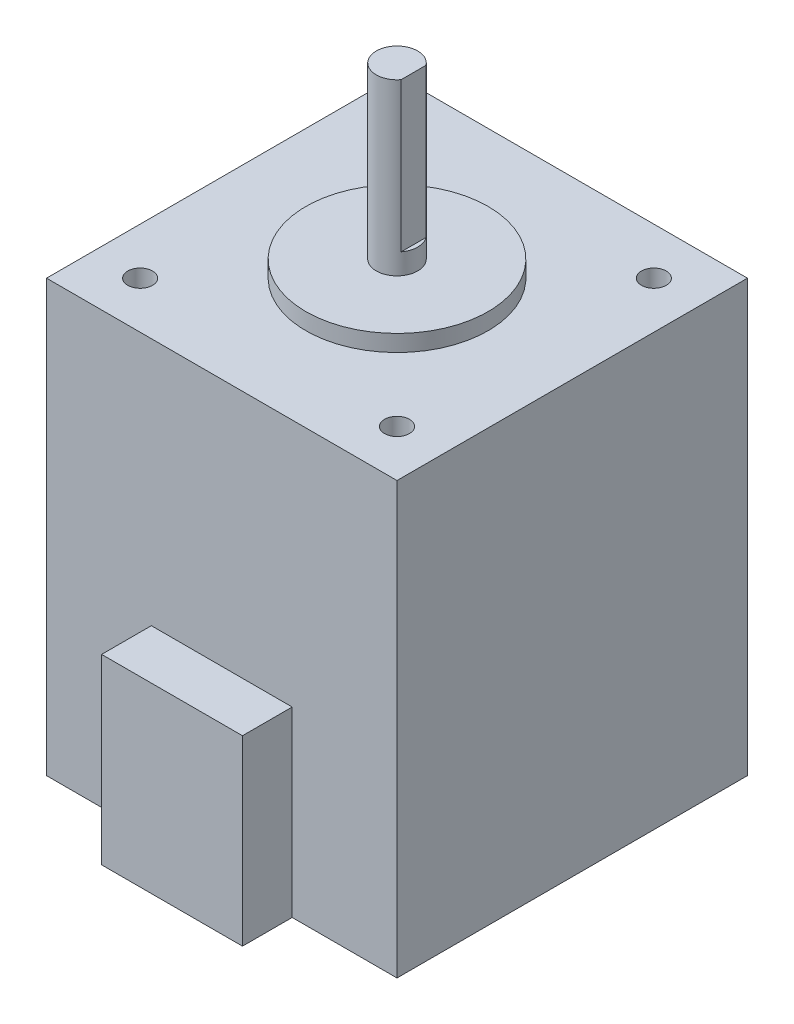
ISO-10303-21;
HEADER;
FILE_DESCRIPTION(('STEP AP214'),'2;1');
FILE_NAME('part.step','',(''),(''),'','','');
FILE_SCHEMA(('AUTOMOTIVE_DESIGN { 1 0 10303 214 1 1 1 1 }'));
ENDSEC;
DATA;
#1=APPLICATION_CONTEXT('core data for automotive mechanical design processes');
#2=APPLICATION_PROTOCOL_DEFINITION('international standard','automotive_design',2000,#1);
#3=PRODUCT_CONTEXT('',#1,'mechanical');
#4=PRODUCT('Part','Part','',(#3));
#5=PRODUCT_RELATED_PRODUCT_CATEGORY('part','',(#4));
#6=PRODUCT_DEFINITION_FORMATION('','',#4);
#7=PRODUCT_DEFINITION_CONTEXT('part definition',#1,'design');
#8=PRODUCT_DEFINITION('design','',#6,#7);
#9=PRODUCT_DEFINITION_SHAPE('','',#8);
#10=(LENGTH_UNIT() NAMED_UNIT(*) SI_UNIT(.MILLI.,.METRE.));
#11=(NAMED_UNIT(*) PLANE_ANGLE_UNIT() SI_UNIT($,.RADIAN.));
#12=(NAMED_UNIT(*) SI_UNIT($,.STERADIAN.) SOLID_ANGLE_UNIT());
#13=UNCERTAINTY_MEASURE_WITH_UNIT(LENGTH_MEASURE(1.E-05),#10,'distance_accuracy_value','');
#14=(GEOMETRIC_REPRESENTATION_CONTEXT(3) GLOBAL_UNCERTAINTY_ASSIGNED_CONTEXT((#13)) GLOBAL_UNIT_ASSIGNED_CONTEXT((#10,
#11,#12)) REPRESENTATION_CONTEXT('',''));
#15=CARTESIAN_POINT('',(0.,0.,0.));
#16=DIRECTION('',(0.,0.,1.));
#17=DIRECTION('',(1.,0.,0.));
#18=AXIS2_PLACEMENT_3D('',#15,#16,#17);
#19=CARTESIAN_POINT('',(-21.15,52.,21.15));
#20=DIRECTION('',(0.,0.,-1.));
#21=DIRECTION('',(-1.,0.,0.));
#22=AXIS2_PLACEMENT_3D('',#19,#20,#21);
#23=PLANE('',#22);
#24=DIRECTION('',(0.,-1.,0.));
#25=VECTOR('',#24,1.);
#26=CARTESIAN_POINT('',(-8.5,0.,21.15));
#27=LINE('',#26,#25);
#28=CARTESIAN_POINT('',(-8.5,22.,21.15));
#29=VERTEX_POINT('',#28);
#30=CARTESIAN_POINT('',(-8.5,0.,21.15));
#31=VERTEX_POINT('',#30);
#32=EDGE_CURVE('E62',#29,#31,#27,.T.);
#33=ORIENTED_EDGE('',*,*,#32,.F.);
#34=DIRECTION('',(-1.,0.,0.));
#35=VECTOR('',#34,1.);
#36=CARTESIAN_POINT('',(-8.5,22.,21.15));
#37=LINE('',#36,#35);
#38=CARTESIAN_POINT('',(8.5,22.,21.15));
#39=VERTEX_POINT('',#38);
#40=EDGE_CURVE('E146',#39,#29,#37,.T.);
#41=ORIENTED_EDGE('',*,*,#40,.F.);
#42=DIRECTION('',(0.,1.,0.));
#43=VECTOR('',#42,1.);
#44=CARTESIAN_POINT('',(8.5,0.,21.15));
#45=LINE('',#44,#43);
#46=CARTESIAN_POINT('',(8.5,0.,21.15));
#47=VERTEX_POINT('',#46);
#48=EDGE_CURVE('E68',#47,#39,#45,.T.);
#49=ORIENTED_EDGE('',*,*,#48,.F.);
#50=DIRECTION('',(1.,0.,0.));
#51=VECTOR('',#50,1.);
#52=CARTESIAN_POINT('',(-21.15,0.,21.15));
#53=LINE('',#52,#51);
#54=CARTESIAN_POINT('',(21.15,0.,21.15));
#55=VERTEX_POINT('',#54);
#56=EDGE_CURVE('E238',#47,#55,#53,.T.);
#57=ORIENTED_EDGE('',*,*,#56,.T.);
#58=DIRECTION('',(0.,-1.,0.));
#59=VECTOR('',#58,1.);
#60=CARTESIAN_POINT('',(21.15,52.,21.15));
#61=LINE('',#60,#59);
#62=CARTESIAN_POINT('',(21.15,52.,21.15));
#63=VERTEX_POINT('',#62);
#64=EDGE_CURVE('E228',#63,#55,#61,.T.);
#65=ORIENTED_EDGE('',*,*,#64,.F.);
#66=DIRECTION('',(1.,0.,0.));
#67=VECTOR('',#66,1.);
#68=CARTESIAN_POINT('',(-21.15,52.,21.15));
#69=LINE('',#68,#67);
#70=CARTESIAN_POINT('',(-21.15,52.,21.15));
#71=VERTEX_POINT('',#70);
#72=EDGE_CURVE('E225',#71,#63,#69,.T.);
#73=ORIENTED_EDGE('',*,*,#72,.F.);
#74=DIRECTION('',(0.,-1.,0.));
#75=VECTOR('',#74,1.);
#76=CARTESIAN_POINT('',(-21.15,52.,21.15));
#77=LINE('',#76,#75);
#78=CARTESIAN_POINT('',(-21.15,0.,21.15));
#79=VERTEX_POINT('',#78);
#80=EDGE_CURVE('E244',#71,#79,#77,.T.);
#81=ORIENTED_EDGE('',*,*,#80,.T.);
#82=EDGE_CURVE('E219',#79,#31,#53,.T.);
#83=ORIENTED_EDGE('',*,*,#82,.T.);
#84=EDGE_LOOP('',(#33,#41,#49,#57,#65,#73,#81,#83));
#85=FACE_BOUND('',#84,.T.);
#86=ADVANCED_FACE('F45',(#85),#23,.F.);
#87=CARTESIAN_POINT('',(21.15,52.,21.15));
#88=DIRECTION('',(-1.,0.,0.));
#89=DIRECTION('',(0.,0.,1.));
#90=AXIS2_PLACEMENT_3D('',#87,#88,#89);
#91=PLANE('',#90);
#92=DIRECTION('',(0.,0.,-1.));
#93=VECTOR('',#92,1.);
#94=CARTESIAN_POINT('',(21.15,0.,21.15));
#95=LINE('',#94,#93);
#96=CARTESIAN_POINT('',(21.15,0.,-21.15));
#97=VERTEX_POINT('',#96);
#98=EDGE_CURVE('E210',#55,#97,#95,.T.);
#99=ORIENTED_EDGE('',*,*,#98,.T.);
#100=DIRECTION('',(0.,-1.,0.));
#101=VECTOR('',#100,1.);
#102=CARTESIAN_POINT('',(21.15,52.,-21.15));
#103=LINE('',#102,#101);
#104=CARTESIAN_POINT('',(21.15,52.,-21.15));
#105=VERTEX_POINT('',#104);
#106=EDGE_CURVE('E251',#105,#97,#103,.T.);
#107=ORIENTED_EDGE('',*,*,#106,.F.);
#108=DIRECTION('',(0.,0.,-1.));
#109=VECTOR('',#108,1.);
#110=CARTESIAN_POINT('',(21.15,52.,21.15));
#111=LINE('',#110,#109);
#112=EDGE_CURVE('E214',#63,#105,#111,.T.);
#113=ORIENTED_EDGE('',*,*,#112,.F.);
#114=ORIENTED_EDGE('',*,*,#64,.T.);
#115=EDGE_LOOP('',(#99,#107,#113,#114));
#116=FACE_BOUND('',#115,.T.);
#117=ADVANCED_FACE('F47',(#116),#91,.F.);
#118=CARTESIAN_POINT('',(-21.15,52.,-21.15));
#119=DIRECTION('',(0.,0.,1.));
#120=DIRECTION('',(1.,0.,0.));
#121=AXIS2_PLACEMENT_3D('',#118,#119,#120);
#122=PLANE('',#121);
#123=DIRECTION('',(-1.,0.,0.));
#124=VECTOR('',#123,1.);
#125=CARTESIAN_POINT('',(-21.15,0.,-21.15));
#126=LINE('',#125,#124);
#127=CARTESIAN_POINT('',(-21.15,0.,-21.15));
#128=VERTEX_POINT('',#127);
#129=EDGE_CURVE('E232',#97,#128,#126,.T.);
#130=ORIENTED_EDGE('',*,*,#129,.T.);
#131=DIRECTION('',(0.,-1.,0.));
#132=VECTOR('',#131,1.);
#133=CARTESIAN_POINT('',(-21.15,52.,-21.15));
#134=LINE('',#133,#132);
#135=CARTESIAN_POINT('',(-21.15,52.,-21.15));
#136=VERTEX_POINT('',#135);
#137=EDGE_CURVE('E248',#136,#128,#134,.T.);
#138=ORIENTED_EDGE('',*,*,#137,.F.);
#139=DIRECTION('',(-1.,0.,0.));
#140=VECTOR('',#139,1.);
#141=CARTESIAN_POINT('',(-21.15,52.,-21.15));
#142=LINE('',#141,#140);
#143=EDGE_CURVE('E218',#105,#136,#142,.T.);
#144=ORIENTED_EDGE('',*,*,#143,.F.);
#145=ORIENTED_EDGE('',*,*,#106,.T.);
#146=EDGE_LOOP('',(#130,#138,#144,#145));
#147=FACE_BOUND('',#146,.T.);
#148=ADVANCED_FACE('F281',(#147),#122,.F.);
#149=CARTESIAN_POINT('',(-21.15,52.,21.15));
#150=DIRECTION('',(1.,0.,0.));
#151=DIRECTION('',(0.,0.,-1.));
#152=AXIS2_PLACEMENT_3D('',#149,#150,#151);
#153=PLANE('',#152);
#154=DIRECTION('',(0.,0.,1.));
#155=VECTOR('',#154,1.);
#156=CARTESIAN_POINT('',(-21.15,0.,21.15));
#157=LINE('',#156,#155);
#158=EDGE_CURVE('E235',#128,#79,#157,.T.);
#159=ORIENTED_EDGE('',*,*,#158,.T.);
#160=ORIENTED_EDGE('',*,*,#80,.F.);
#161=DIRECTION('',(0.,0.,1.));
#162=VECTOR('',#161,1.);
#163=CARTESIAN_POINT('',(-21.15,52.,21.15));
#164=LINE('',#163,#162);
#165=EDGE_CURVE('E222',#136,#71,#164,.T.);
#166=ORIENTED_EDGE('',*,*,#165,.F.);
#167=ORIENTED_EDGE('',*,*,#137,.T.);
#168=EDGE_LOOP('',(#159,#160,#166,#167));
#169=FACE_BOUND('',#168,.T.);
#170=ADVANCED_FACE('F265',(#169),#153,.F.);
#171=CARTESIAN_POINT('',(0.,52.,0.));
#172=DIRECTION('',(0.,-1.,0.));
#173=DIRECTION('',(0.,0.,-1.));
#174=AXIS2_PLACEMENT_3D('',#171,#172,#173);
#175=PLANE('',#174);
#176=CARTESIAN_POINT('',(0.,52.,0.));
#177=DIRECTION('',(0.,-1.,0.));
#178=DIRECTION('',(0.,0.,-1.));
#179=AXIS2_PLACEMENT_3D('',#176,#177,#178);
#180=CIRCLE('',#179,11.);
#181=CARTESIAN_POINT('',(0.,52.,-11.));
#182=VERTEX_POINT('',#181);
#183=EDGE_CURVE('E49',#182,#182,#180,.F.);
#184=ORIENTED_EDGE('',*,*,#183,.F.);
#185=EDGE_LOOP('',(#184));
#186=FACE_BOUND('',#185,.T.);
#187=CARTESIAN_POINT('',(-15.5000000000002,52.,15.4999999999998));
#188=DIRECTION('',(0.,1.,0.));
#189=DIRECTION('',(0.,0.,1.));
#190=AXIS2_PLACEMENT_3D('',#187,#188,#189);
#191=CIRCLE('',#190,1.5);
#192=CARTESIAN_POINT('',(-15.5000000000002,52.,16.9999999999998));
#193=VERTEX_POINT('',#192);
#194=EDGE_CURVE('E199',#193,#193,#191,.T.);
#195=ORIENTED_EDGE('',*,*,#194,.F.);
#196=EDGE_LOOP('',(#195));
#197=FACE_BOUND('',#196,.T.);
#198=CARTESIAN_POINT('',(15.4999999999999,52.,15.5000000000001));
#199=DIRECTION('',(0.,1.,0.));
#200=DIRECTION('',(0.,0.,1.));
#201=AXIS2_PLACEMENT_3D('',#198,#199,#200);
#202=CIRCLE('',#201,1.5);
#203=CARTESIAN_POINT('',(15.4999999999999,52.,17.0000000000001));
#204=VERTEX_POINT('',#203);
#205=EDGE_CURVE('E191',#204,#204,#202,.T.);
#206=ORIENTED_EDGE('',*,*,#205,.F.);
#207=EDGE_LOOP('',(#206));
#208=FACE_BOUND('',#207,.T.);
#209=CARTESIAN_POINT('',(15.5,52.,-15.5));
#210=DIRECTION('',(0.,1.,0.));
#211=DIRECTION('',(0.,0.,1.));
#212=AXIS2_PLACEMENT_3D('',#209,#210,#211);
#213=CIRCLE('',#212,1.5);
#214=CARTESIAN_POINT('',(15.5,52.,-14.));
#215=VERTEX_POINT('',#214);
#216=EDGE_CURVE('E182',#215,#215,#213,.T.);
#217=ORIENTED_EDGE('',*,*,#216,.F.);
#218=EDGE_LOOP('',(#217));
#219=FACE_BOUND('',#218,.T.);
#220=CARTESIAN_POINT('',(-15.5,52.,-15.5));
#221=DIRECTION('',(0.,1.,0.));
#222=DIRECTION('',(0.,0.,1.));
#223=AXIS2_PLACEMENT_3D('',#220,#221,#222);
#224=CIRCLE('',#223,1.5);
#225=CARTESIAN_POINT('',(-15.5,52.,-14.));
#226=VERTEX_POINT('',#225);
#227=EDGE_CURVE('E186',#226,#226,#224,.T.);
#228=ORIENTED_EDGE('',*,*,#227,.F.);
#229=EDGE_LOOP('',(#228));
#230=FACE_BOUND('',#229,.T.);
#231=ORIENTED_EDGE('',*,*,#112,.T.);
#232=ORIENTED_EDGE('',*,*,#143,.T.);
#233=ORIENTED_EDGE('',*,*,#165,.T.);
#234=ORIENTED_EDGE('',*,*,#72,.T.);
#235=EDGE_LOOP('',(#231,#232,#233,#234));
#236=FACE_BOUND('',#235,.T.);
#237=ADVANCED_FACE('F262',(#186,#197,#208,#219,#230,#236),#175,.F.);
#238=CARTESIAN_POINT('',(0.,0.,0.));
#239=DIRECTION('',(0.,-1.,0.));
#240=DIRECTION('',(0.,0.,-1.));
#241=AXIS2_PLACEMENT_3D('',#238,#239,#240);
#242=PLANE('',#241);
#243=ORIENTED_EDGE('',*,*,#98,.F.);
#244=ORIENTED_EDGE('',*,*,#56,.F.);
#245=DIRECTION('',(0.,0.,-1.));
#246=VECTOR('',#245,1.);
#247=CARTESIAN_POINT('',(8.5,0.,27.15));
#248=LINE('',#247,#246);
#249=CARTESIAN_POINT('',(8.5,0.,27.15));
#250=VERTEX_POINT('',#249);
#251=EDGE_CURVE('E131',#250,#47,#248,.T.);
#252=ORIENTED_EDGE('',*,*,#251,.F.);
#253=DIRECTION('',(1.,0.,0.));
#254=VECTOR('',#253,1.);
#255=CARTESIAN_POINT('',(-8.5,0.,27.15));
#256=LINE('',#255,#254);
#257=CARTESIAN_POINT('',(-8.5,0.,27.15));
#258=VERTEX_POINT('',#257);
#259=EDGE_CURVE('E123',#258,#250,#256,.T.);
#260=ORIENTED_EDGE('',*,*,#259,.F.);
#261=DIRECTION('',(0.,0.,-1.));
#262=VECTOR('',#261,1.);
#263=CARTESIAN_POINT('',(-8.5,0.,27.15));
#264=LINE('',#263,#262);
#265=EDGE_CURVE('E129',#258,#31,#264,.T.);
#266=ORIENTED_EDGE('',*,*,#265,.T.);
#267=ORIENTED_EDGE('',*,*,#82,.F.);
#268=ORIENTED_EDGE('',*,*,#158,.F.);
#269=ORIENTED_EDGE('',*,*,#129,.F.);
#270=EDGE_LOOP('',(#243,#244,#252,#260,#266,#267,#268,#269));
#271=FACE_BOUND('',#270,.T.);
#272=ADVANCED_FACE('F126',(#271),#242,.T.);
#273=CARTESIAN_POINT('',(-15.5,48.,-15.5));
#274=DIRECTION('',(0.,1.,0.));
#275=DIRECTION('',(0.,0.,1.));
#276=AXIS2_PLACEMENT_3D('',#273,#274,#275);
#277=CYLINDRICAL_SURFACE('',#276,1.5);
#278=CARTESIAN_POINT('',(-15.5,48.,-15.5));
#279=DIRECTION('',(0.,1.,0.));
#280=DIRECTION('',(0.,0.,1.));
#281=AXIS2_PLACEMENT_3D('',#278,#279,#280);
#282=CIRCLE('',#281,1.5);
#283=CARTESIAN_POINT('',(-15.5,48.,-14.));
#284=VERTEX_POINT('',#283);
#285=EDGE_CURVE('E206',#284,#284,#282,.T.);
#286=ORIENTED_EDGE('',*,*,#285,.F.);
#287=EDGE_LOOP('',(#286));
#288=FACE_BOUND('',#287,.T.);
#289=ORIENTED_EDGE('',*,*,#227,.T.);
#290=EDGE_LOOP('',(#289));
#291=FACE_BOUND('',#290,.T.);
#292=ADVANCED_FACE('F311',(#288,#291),#277,.F.);
#293=CARTESIAN_POINT('',(-15.5,48.,-15.5));
#294=DIRECTION('',(0.,1.,0.));
#295=DIRECTION('',(0.,0.,1.));
#296=AXIS2_PLACEMENT_3D('',#293,#294,#295);
#297=PLANE('',#296);
#298=ORIENTED_EDGE('',*,*,#285,.T.);
#299=EDGE_LOOP('',(#298));
#300=FACE_BOUND('',#299,.T.);
#301=ADVANCED_FACE('F315',(#300),#297,.T.);
#302=CARTESIAN_POINT('',(15.5,48.,-15.5));
#303=DIRECTION('',(0.,1.,0.));
#304=DIRECTION('',(0.,0.,1.));
#305=AXIS2_PLACEMENT_3D('',#302,#303,#304);
#306=CYLINDRICAL_SURFACE('',#305,1.5);
#307=CARTESIAN_POINT('',(15.5,48.,-15.5));
#308=DIRECTION('',(0.,1.,0.));
#309=DIRECTION('',(0.,0.,1.));
#310=AXIS2_PLACEMENT_3D('',#307,#308,#309);
#311=CIRCLE('',#310,1.5);
#312=CARTESIAN_POINT('',(15.5,48.,-14.));
#313=VERTEX_POINT('',#312);
#314=EDGE_CURVE('E187',#313,#313,#311,.T.);
#315=ORIENTED_EDGE('',*,*,#314,.F.);
#316=EDGE_LOOP('',(#315));
#317=FACE_BOUND('',#316,.T.);
#318=ORIENTED_EDGE('',*,*,#216,.T.);
#319=EDGE_LOOP('',(#318));
#320=FACE_BOUND('',#319,.T.);
#321=ADVANCED_FACE('F325',(#317,#320),#306,.F.);
#322=CARTESIAN_POINT('',(15.5,48.,-15.5));
#323=DIRECTION('',(0.,1.,0.));
#324=DIRECTION('',(0.,0.,1.));
#325=AXIS2_PLACEMENT_3D('',#322,#323,#324);
#326=PLANE('',#325);
#327=ORIENTED_EDGE('',*,*,#314,.T.);
#328=EDGE_LOOP('',(#327));
#329=FACE_BOUND('',#328,.T.);
#330=ADVANCED_FACE('F334',(#329),#326,.T.);
#331=CARTESIAN_POINT('',(15.4999999999999,48.,15.5000000000001));
#332=DIRECTION('',(0.,1.,0.));
#333=DIRECTION('',(0.,0.,1.));
#334=AXIS2_PLACEMENT_3D('',#331,#332,#333);
#335=CYLINDRICAL_SURFACE('',#334,1.5);
#336=CARTESIAN_POINT('',(15.4999999999999,48.,15.5000000000001));
#337=DIRECTION('',(0.,1.,0.));
#338=DIRECTION('',(0.,0.,1.));
#339=AXIS2_PLACEMENT_3D('',#336,#337,#338);
#340=CIRCLE('',#339,1.5);
#341=CARTESIAN_POINT('',(15.4999999999999,48.,17.0000000000001));
#342=VERTEX_POINT('',#341);
#343=EDGE_CURVE('E195',#342,#342,#340,.T.);
#344=ORIENTED_EDGE('',*,*,#343,.F.);
#345=EDGE_LOOP('',(#344));
#346=FACE_BOUND('',#345,.T.);
#347=ORIENTED_EDGE('',*,*,#205,.T.);
#348=EDGE_LOOP('',(#347));
#349=FACE_BOUND('',#348,.T.);
#350=ADVANCED_FACE('F343',(#346,#349),#335,.F.);
#351=CARTESIAN_POINT('',(15.4999999999999,48.,15.5000000000001));
#352=DIRECTION('',(0.,1.,0.));
#353=DIRECTION('',(0.,0.,1.));
#354=AXIS2_PLACEMENT_3D('',#351,#352,#353);
#355=PLANE('',#354);
#356=ORIENTED_EDGE('',*,*,#343,.T.);
#357=EDGE_LOOP('',(#356));
#358=FACE_BOUND('',#357,.T.);
#359=ADVANCED_FACE('F352',(#358),#355,.T.);
#360=CARTESIAN_POINT('',(-15.5000000000002,48.,15.4999999999998));
#361=DIRECTION('',(0.,1.,0.));
#362=DIRECTION('',(0.,0.,1.));
#363=AXIS2_PLACEMENT_3D('',#360,#361,#362);
#364=CYLINDRICAL_SURFACE('',#363,1.5);
#365=CARTESIAN_POINT('',(-15.5000000000002,48.,15.4999999999998));
#366=DIRECTION('',(0.,1.,0.));
#367=DIRECTION('',(0.,0.,1.));
#368=AXIS2_PLACEMENT_3D('',#365,#366,#367);
#369=CIRCLE('',#368,1.5);
#370=CARTESIAN_POINT('',(-15.5000000000002,48.,16.9999999999998));
#371=VERTEX_POINT('',#370);
#372=EDGE_CURVE('E181',#371,#371,#369,.T.);
#373=ORIENTED_EDGE('',*,*,#372,.F.);
#374=EDGE_LOOP('',(#373));
#375=FACE_BOUND('',#374,.T.);
#376=ORIENTED_EDGE('',*,*,#194,.T.);
#377=EDGE_LOOP('',(#376));
#378=FACE_BOUND('',#377,.T.);
#379=ADVANCED_FACE('F361',(#375,#378),#364,.F.);
#380=CARTESIAN_POINT('',(-15.5000000000002,48.,15.4999999999998));
#381=DIRECTION('',(0.,1.,0.));
#382=DIRECTION('',(0.,0.,1.));
#383=AXIS2_PLACEMENT_3D('',#380,#381,#382);
#384=PLANE('',#383);
#385=ORIENTED_EDGE('',*,*,#372,.T.);
#386=EDGE_LOOP('',(#385));
#387=FACE_BOUND('',#386,.T.);
#388=ADVANCED_FACE('F370',(#387),#384,.T.);
#389=CARTESIAN_POINT('',(0.,54.,0.));
#390=DIRECTION('',(0.,-1.,0.));
#391=DIRECTION('',(0.,0.,-1.));
#392=AXIS2_PLACEMENT_3D('',#389,#390,#391);
#393=CYLINDRICAL_SURFACE('',#392,11.);
#394=CARTESIAN_POINT('',(0.,54.,0.));
#395=DIRECTION('',(0.,1.,0.));
#396=DIRECTION('',(0.,0.,1.));
#397=AXIS2_PLACEMENT_3D('',#394,#395,#396);
#398=CIRCLE('',#397,11.);
#399=CARTESIAN_POINT('',(0.,54.,11.));
#400=VERTEX_POINT('',#399);
#401=EDGE_CURVE('E176',#400,#400,#398,.T.);
#402=ORIENTED_EDGE('',*,*,#401,.F.);
#403=EDGE_LOOP('',(#402));
#404=FACE_BOUND('',#403,.T.);
#405=ORIENTED_EDGE('',*,*,#183,.T.);
#406=EDGE_LOOP('',(#405));
#407=FACE_BOUND('',#406,.T.);
#408=ADVANCED_FACE('F260',(#404,#407),#393,.T.);
#409=CARTESIAN_POINT('',(0.,54.,0.));
#410=DIRECTION('',(0.,1.,0.));
#411=DIRECTION('',(0.,0.,1.));
#412=AXIS2_PLACEMENT_3D('',#409,#410,#411);
#413=PLANE('',#412);
#414=CARTESIAN_POINT('',(0.,54.,0.));
#415=DIRECTION('',(0.,1.,0.));
#416=DIRECTION('',(0.,0.,1.));
#417=AXIS2_PLACEMENT_3D('',#414,#415,#416);
#418=CIRCLE('',#417,2.5);
#419=CARTESIAN_POINT('',(0.,54.,2.5));
#420=VERTEX_POINT('',#419);
#421=EDGE_CURVE('E11',#420,#420,#418,.T.);
#422=ORIENTED_EDGE('',*,*,#421,.F.);
#423=EDGE_LOOP('',(#422));
#424=FACE_BOUND('',#423,.T.);
#425=ORIENTED_EDGE('',*,*,#401,.T.);
#426=EDGE_LOOP('',(#425));
#427=FACE_BOUND('',#426,.T.);
#428=ADVANCED_FACE('F391',(#424,#427),#413,.T.);
#429=CARTESIAN_POINT('',(0.,74.5,0.));
#430=DIRECTION('',(0.,-1.,0.));
#431=DIRECTION('',(0.,0.,-1.));
#432=AXIS2_PLACEMENT_3D('',#429,#430,#431);
#433=CYLINDRICAL_SURFACE('',#432,2.5);
#434=CARTESIAN_POINT('',(0.,74.5,0.));
#435=DIRECTION('',(0.,1.,0.));
#436=DIRECTION('',(0.,0.,1.));
#437=AXIS2_PLACEMENT_3D('',#434,#435,#436);
#438=CIRCLE('',#437,2.5);
#439=CARTESIAN_POINT('',(2.,74.5,-1.5));
#440=VERTEX_POINT('',#439);
#441=CARTESIAN_POINT('',(2.,74.5,1.5));
#442=VERTEX_POINT('',#441);
#443=EDGE_CURVE('E171',#440,#442,#438,.T.);
#444=ORIENTED_EDGE('',*,*,#443,.F.);
#445=DIRECTION('',(0.,1.,0.));
#446=VECTOR('',#445,1.);
#447=CARTESIAN_POINT('',(2.,56.5,-1.5));
#448=LINE('',#447,#446);
#449=CARTESIAN_POINT('',(2.,56.5,-1.5));
#450=VERTEX_POINT('',#449);
#451=EDGE_CURVE('E165',#450,#440,#448,.T.);
#452=ORIENTED_EDGE('',*,*,#451,.F.);
#453=CARTESIAN_POINT('',(0.,56.5,0.));
#454=DIRECTION('',(0.,1.,0.));
#455=DIRECTION('',(0.,0.,1.));
#456=AXIS2_PLACEMENT_3D('',#453,#454,#455);
#457=CIRCLE('',#456,2.5);
#458=CARTESIAN_POINT('',(2.,56.5,1.5));
#459=VERTEX_POINT('',#458);
#460=EDGE_CURVE('E154',#459,#450,#457,.T.);
#461=ORIENTED_EDGE('',*,*,#460,.F.);
#462=DIRECTION('',(0.,1.,0.));
#463=VECTOR('',#462,1.);
#464=CARTESIAN_POINT('',(2.,56.5,1.5));
#465=LINE('',#464,#463);
#466=EDGE_CURVE('E167',#459,#442,#465,.T.);
#467=ORIENTED_EDGE('',*,*,#466,.T.);
#468=EDGE_LOOP('',(#444,#452,#461,#467));
#469=FACE_BOUND('',#468,.T.);
#470=ORIENTED_EDGE('',*,*,#421,.T.);
#471=EDGE_LOOP('',(#470));
#472=FACE_BOUND('',#471,.T.);
#473=ADVANCED_FACE('F400',(#469,#472),#433,.T.);
#474=CARTESIAN_POINT('',(0.,74.5,0.));
#475=DIRECTION('',(0.,1.,0.));
#476=DIRECTION('',(0.,0.,1.));
#477=AXIS2_PLACEMENT_3D('',#474,#475,#476);
#478=PLANE('',#477);
#479=DIRECTION('',(0.,0.,1.));
#480=VECTOR('',#479,1.);
#481=CARTESIAN_POINT('',(2.,74.5,0.));
#482=LINE('',#481,#480);
#483=EDGE_CURVE('E150',#440,#442,#482,.T.);
#484=ORIENTED_EDGE('',*,*,#483,.F.);
#485=ORIENTED_EDGE('',*,*,#443,.T.);
#486=EDGE_LOOP('',(#484,#485));
#487=FACE_BOUND('',#486,.T.);
#488=ADVANCED_FACE('F409',(#487),#478,.T.);
#489=CARTESIAN_POINT('',(2.,56.5,0.));
#490=DIRECTION('',(-1.,0.,0.));
#491=DIRECTION('',(0.,0.,1.));
#492=AXIS2_PLACEMENT_3D('',#489,#490,#491);
#493=PLANE('',#492);
#494=ORIENTED_EDGE('',*,*,#483,.T.);
#495=ORIENTED_EDGE('',*,*,#466,.F.);
#496=DIRECTION('',(0.,0.,1.));
#497=VECTOR('',#496,1.);
#498=CARTESIAN_POINT('',(2.,56.5,0.));
#499=LINE('',#498,#497);
#500=EDGE_CURVE('E162',#450,#459,#499,.T.);
#501=ORIENTED_EDGE('',*,*,#500,.F.);
#502=ORIENTED_EDGE('',*,*,#451,.T.);
#503=EDGE_LOOP('',(#494,#495,#501,#502));
#504=FACE_BOUND('',#503,.T.);
#505=ADVANCED_FACE('F418',(#504),#493,.F.);
#506=CARTESIAN_POINT('',(0.,56.5,0.));
#507=DIRECTION('',(0.,1.,0.));
#508=DIRECTION('',(0.,0.,1.));
#509=AXIS2_PLACEMENT_3D('',#506,#507,#508);
#510=PLANE('',#509);
#511=ORIENTED_EDGE('',*,*,#460,.T.);
#512=ORIENTED_EDGE('',*,*,#500,.T.);
#513=EDGE_LOOP('',(#511,#512));
#514=FACE_BOUND('',#513,.T.);
#515=ADVANCED_FACE('F426',(#514),#510,.T.);
#516=CARTESIAN_POINT('',(-8.5,0.,27.15));
#517=DIRECTION('',(1.,0.,0.));
#518=DIRECTION('',(0.,0.,-1.));
#519=AXIS2_PLACEMENT_3D('',#516,#517,#518);
#520=PLANE('',#519);
#521=ORIENTED_EDGE('',*,*,#32,.T.);
#522=ORIENTED_EDGE('',*,*,#265,.F.);
#523=DIRECTION('',(0.,-1.,0.));
#524=VECTOR('',#523,1.);
#525=CARTESIAN_POINT('',(-8.5,0.,27.15));
#526=LINE('',#525,#524);
#527=CARTESIAN_POINT('',(-8.5,22.,27.15));
#528=VERTEX_POINT('',#527);
#529=EDGE_CURVE('E136',#528,#258,#526,.T.);
#530=ORIENTED_EDGE('',*,*,#529,.F.);
#531=DIRECTION('',(0.,0.,-1.));
#532=VECTOR('',#531,1.);
#533=CARTESIAN_POINT('',(-8.5,22.,27.15));
#534=LINE('',#533,#532);
#535=EDGE_CURVE('E488',#528,#29,#534,.T.);
#536=ORIENTED_EDGE('',*,*,#535,.T.);
#537=EDGE_LOOP('',(#521,#522,#530,#536));
#538=FACE_BOUND('',#537,.T.);
#539=ADVANCED_FACE('F148',(#538),#520,.F.);
#540=CARTESIAN_POINT('',(8.5,0.,27.15));
#541=DIRECTION('',(-1.,0.,0.));
#542=DIRECTION('',(0.,0.,1.));
#543=AXIS2_PLACEMENT_3D('',#540,#541,#542);
#544=PLANE('',#543);
#545=ORIENTED_EDGE('',*,*,#48,.T.);
#546=DIRECTION('',(0.,0.,-1.));
#547=VECTOR('',#546,1.);
#548=CARTESIAN_POINT('',(8.5,22.,27.15));
#549=LINE('',#548,#547);
#550=CARTESIAN_POINT('',(8.5,22.,27.15));
#551=VERTEX_POINT('',#550);
#552=EDGE_CURVE('E156',#551,#39,#549,.T.);
#553=ORIENTED_EDGE('',*,*,#552,.F.);
#554=DIRECTION('',(0.,1.,0.));
#555=VECTOR('',#554,1.);
#556=CARTESIAN_POINT('',(8.5,0.,27.15));
#557=LINE('',#556,#555);
#558=EDGE_CURVE('E135',#250,#551,#557,.T.);
#559=ORIENTED_EDGE('',*,*,#558,.F.);
#560=ORIENTED_EDGE('',*,*,#251,.T.);
#561=EDGE_LOOP('',(#545,#553,#559,#560));
#562=FACE_BOUND('',#561,.T.);
#563=ADVANCED_FACE('F457',(#562),#544,.F.);
#564=CARTESIAN_POINT('',(-8.5,22.,27.15));
#565=DIRECTION('',(0.,-1.,0.));
#566=DIRECTION('',(0.,0.,-1.));
#567=AXIS2_PLACEMENT_3D('',#564,#565,#566);
#568=PLANE('',#567);
#569=ORIENTED_EDGE('',*,*,#40,.T.);
#570=ORIENTED_EDGE('',*,*,#535,.F.);
#571=DIRECTION('',(-1.,0.,0.));
#572=VECTOR('',#571,1.);
#573=CARTESIAN_POINT('',(-8.5,22.,27.15));
#574=LINE('',#573,#572);
#575=EDGE_CURVE('E141',#551,#528,#574,.T.);
#576=ORIENTED_EDGE('',*,*,#575,.F.);
#577=ORIENTED_EDGE('',*,*,#552,.T.);
#578=EDGE_LOOP('',(#569,#570,#576,#577));
#579=FACE_BOUND('',#578,.T.);
#580=ADVANCED_FACE('F466',(#579),#568,.F.);
#581=CARTESIAN_POINT('',(0.,0.,27.15));
#582=DIRECTION('',(0.,0.,-1.));
#583=DIRECTION('',(-1.,0.,0.));
#584=AXIS2_PLACEMENT_3D('',#581,#582,#583);
#585=PLANE('',#584);
#586=ORIENTED_EDGE('',*,*,#529,.T.);
#587=ORIENTED_EDGE('',*,*,#259,.T.);
#588=ORIENTED_EDGE('',*,*,#558,.T.);
#589=ORIENTED_EDGE('',*,*,#575,.T.);
#590=EDGE_LOOP('',(#586,#587,#588,#589));
#591=FACE_BOUND('',#590,.T.);
#592=ADVANCED_FACE('F139',(#591),#585,.F.);
#593=CLOSED_SHELL('',(#86,#117,#148,#170,#237,#272,#292,#301,#321,#330,#350,#359,#379,#388,#408,
#428,#473,#488,#505,#515,#539,#563,#580,#592));
#594=MANIFOLD_SOLID_BREP('B2',#593);
#595=ADVANCED_BREP_SHAPE_REPRESENTATION('',(#18,#594),#14);
#596=SHAPE_DEFINITION_REPRESENTATION(#9,#595);
ENDSEC;
END-ISO-10303-21;
